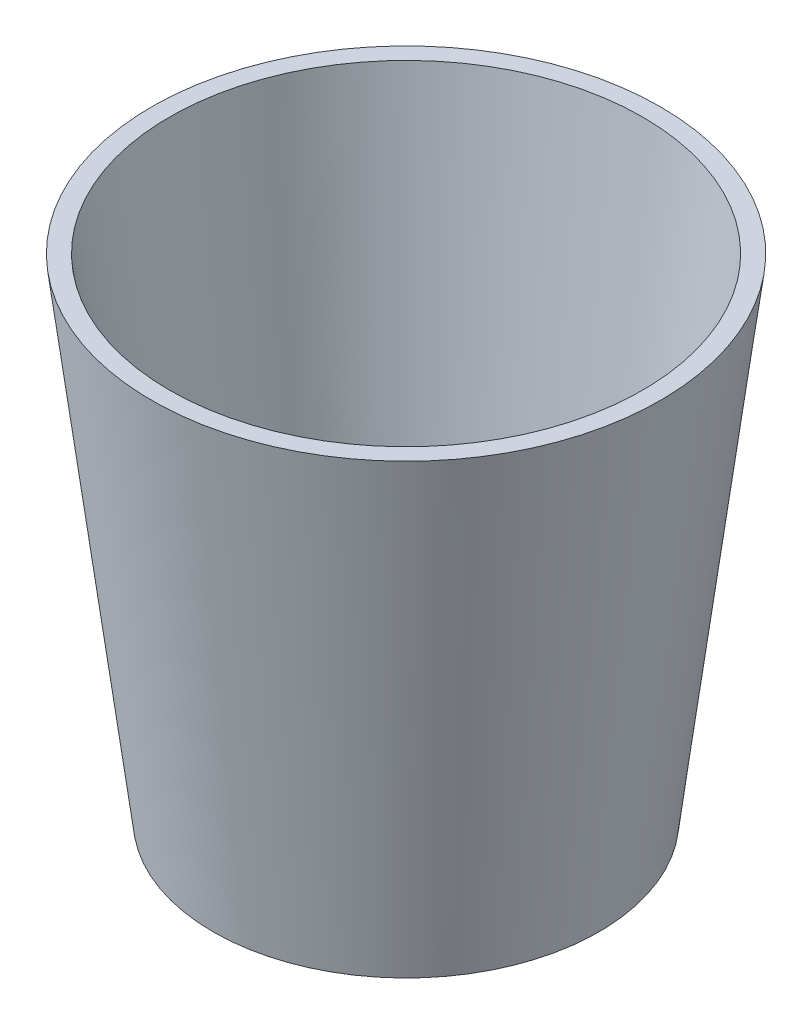
ISO-10303-21;
HEADER;
FILE_DESCRIPTION(('STEP AP214'),'2;1');
FILE_NAME('part.step','',(''),(''),'','','');
FILE_SCHEMA(('AUTOMOTIVE_DESIGN { 1 0 10303 214 1 1 1 1 }'));
ENDSEC;
DATA;
#1=APPLICATION_CONTEXT('core data for automotive mechanical design processes');
#2=APPLICATION_PROTOCOL_DEFINITION('international standard','automotive_design',2000,#1);
#3=PRODUCT_CONTEXT('',#1,'mechanical');
#4=PRODUCT('Part','Part','',(#3));
#5=PRODUCT_RELATED_PRODUCT_CATEGORY('part','',(#4));
#6=PRODUCT_DEFINITION_FORMATION('','',#4);
#7=PRODUCT_DEFINITION_CONTEXT('part definition',#1,'design');
#8=PRODUCT_DEFINITION('design','',#6,#7);
#9=PRODUCT_DEFINITION_SHAPE('','',#8);
#10=(LENGTH_UNIT() NAMED_UNIT(*) SI_UNIT(.MILLI.,.METRE.));
#11=(NAMED_UNIT(*) PLANE_ANGLE_UNIT() SI_UNIT($,.RADIAN.));
#12=(NAMED_UNIT(*) SI_UNIT($,.STERADIAN.) SOLID_ANGLE_UNIT());
#13=UNCERTAINTY_MEASURE_WITH_UNIT(LENGTH_MEASURE(1.E-05),#10,'distance_accuracy_value','');
#14=(GEOMETRIC_REPRESENTATION_CONTEXT(3) GLOBAL_UNCERTAINTY_ASSIGNED_CONTEXT((#13)) GLOBAL_UNIT_ASSIGNED_CONTEXT((#10,
#11,#12)) REPRESENTATION_CONTEXT('',''));
#15=CARTESIAN_POINT('',(0.,0.,0.));
#16=DIRECTION('',(0.,0.,1.));
#17=DIRECTION('',(1.,0.,0.));
#18=AXIS2_PLACEMENT_3D('',#15,#16,#17);
#19=CARTESIAN_POINT('',(0.,80.,40.));
#20=DIRECTION('',(0.,-1.,0.));
#21=DIRECTION('',(0.,0.,-1.));
#22=AXIS2_PLACEMENT_3D('',#19,#20,#21);
#23=PLANE('',#22);
#24=CARTESIAN_POINT('',(0.,80.,0.));
#25=DIRECTION('',(0.,-1.,0.));
#26=DIRECTION('',(0.,0.,-1.));
#27=AXIS2_PLACEMENT_3D('',#24,#25,#26);
#28=CIRCLE('',#27,43.);
#29=CARTESIAN_POINT('',(0.,80.,-43.));
#30=VERTEX_POINT('',#29);
#31=EDGE_CURVE('E10',#30,#30,#28,.T.);
#32=ORIENTED_EDGE('',*,*,#31,.F.);
#33=EDGE_LOOP('',(#32));
#34=FACE_BOUND('',#33,.T.);
#35=CARTESIAN_POINT('',(0.,80.,0.));
#36=DIRECTION('',(0.,-1.,0.));
#37=DIRECTION('',(0.,0.,-1.));
#38=AXIS2_PLACEMENT_3D('',#35,#36,#37);
#39=CIRCLE('',#38,40.);
#40=CARTESIAN_POINT('',(0.,80.,-40.));
#41=VERTEX_POINT('',#40);
#42=EDGE_CURVE('E45',#41,#41,#39,.T.);
#43=ORIENTED_EDGE('',*,*,#42,.T.);
#44=EDGE_LOOP('',(#43));
#45=FACE_BOUND('',#44,.T.);
#46=ADVANCED_FACE('F31',(#34,#45),#23,.F.);
#47=CARTESIAN_POINT('',(0.,80.,0.));
#48=DIRECTION('',(0.,1.,0.));
#49=DIRECTION('',(0.,0.,1.));
#50=AXIS2_PLACEMENT_3D('',#47,#48,#49);
#51=CONICAL_SURFACE('',#50,43.,0.124354994546761);
#52=CARTESIAN_POINT('',(0.,-3.,0.));
#53=DIRECTION('',(0.,-1.,0.));
#54=DIRECTION('',(0.,0.,-1.));
#55=AXIS2_PLACEMENT_3D('',#52,#53,#54);
#56=CIRCLE('',#55,32.625);
#57=CARTESIAN_POINT('',(0.,-3.,-32.625));
#58=VERTEX_POINT('',#57);
#59=EDGE_CURVE('E37',#58,#58,#56,.T.);
#60=ORIENTED_EDGE('',*,*,#59,.F.);
#61=EDGE_LOOP('',(#60));
#62=FACE_BOUND('',#61,.T.);
#63=ORIENTED_EDGE('',*,*,#31,.T.);
#64=EDGE_LOOP('',(#63));
#65=FACE_BOUND('',#64,.T.);
#66=ADVANCED_FACE('F65',(#62,#65),#51,.T.);
#67=CARTESIAN_POINT('',(0.,-3.,0.));
#68=DIRECTION('',(0.,1.,0.));
#69=DIRECTION('',(0.,0.,1.));
#70=AXIS2_PLACEMENT_3D('',#67,#68,#69);
#71=PLANE('',#70);
#72=ORIENTED_EDGE('',*,*,#59,.T.);
#73=EDGE_LOOP('',(#72));
#74=FACE_BOUND('',#73,.T.);
#75=ADVANCED_FACE('F60',(#74),#71,.F.);
#76=CARTESIAN_POINT('',(0.,0.,0.));
#77=DIRECTION('',(0.,-1.,0.));
#78=DIRECTION('',(0.,0.,-1.));
#79=AXIS2_PLACEMENT_3D('',#76,#77,#78);
#80=PLANE('',#79);
#81=CARTESIAN_POINT('',(0.,0.,0.));
#82=DIRECTION('',(0.,-1.,0.));
#83=DIRECTION('',(0.,0.,-1.));
#84=AXIS2_PLACEMENT_3D('',#81,#82,#83);
#85=CIRCLE('',#84,30.);
#86=CARTESIAN_POINT('',(0.,0.,-30.));
#87=VERTEX_POINT('',#86);
#88=EDGE_CURVE('E41',#87,#87,#85,.T.);
#89=ORIENTED_EDGE('',*,*,#88,.F.);
#90=EDGE_LOOP('',(#89));
#91=FACE_BOUND('',#90,.T.);
#92=ADVANCED_FACE('F55',(#91),#80,.F.);
#93=CARTESIAN_POINT('',(0.,0.,0.));
#94=DIRECTION('',(0.,1.,0.));
#95=DIRECTION('',(0.,0.,1.));
#96=AXIS2_PLACEMENT_3D('',#93,#94,#95);
#97=CONICAL_SURFACE('',#96,30.,0.124354994546761);
#98=ORIENTED_EDGE('',*,*,#42,.F.);
#99=EDGE_LOOP('',(#98));
#100=FACE_BOUND('',#99,.T.);
#101=ORIENTED_EDGE('',*,*,#88,.T.);
#102=EDGE_LOOP('',(#101));
#103=FACE_BOUND('',#102,.T.);
#104=ADVANCED_FACE('F52',(#100,#103),#97,.F.);
#105=CLOSED_SHELL('',(#46,#66,#75,#92,#104));
#106=MANIFOLD_SOLID_BREP('B2',#105);
#107=ADVANCED_BREP_SHAPE_REPRESENTATION('',(#18,#106),#14);
#108=SHAPE_DEFINITION_REPRESENTATION(#9,#107);
ENDSEC;
END-ISO-10303-21;
